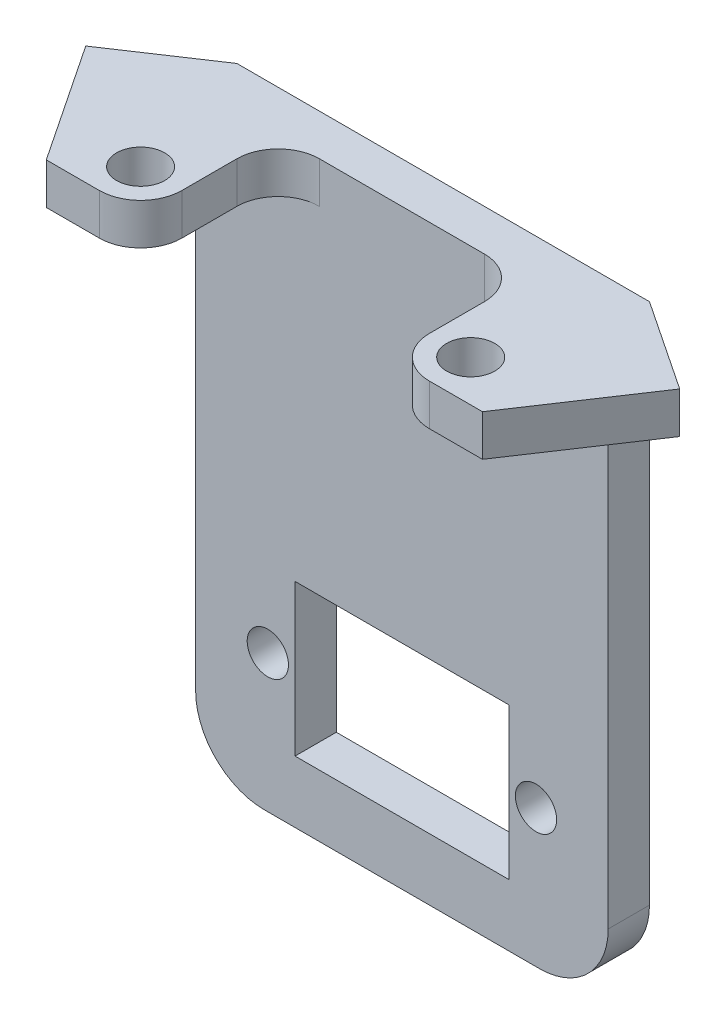
ISO-10303-21;
HEADER;
FILE_DESCRIPTION(('STEP AP214'),'2;1');
FILE_NAME('part.step','',(''),(''),'','','');
FILE_SCHEMA(('AUTOMOTIVE_DESIGN { 1 0 10303 214 1 1 1 1 }'));
ENDSEC;
DATA;
#1=APPLICATION_CONTEXT('core data for automotive mechanical design processes');
#2=APPLICATION_PROTOCOL_DEFINITION('international standard','automotive_design',2000,#1);
#3=PRODUCT_CONTEXT('',#1,'mechanical');
#4=PRODUCT('Part','Part','',(#3));
#5=PRODUCT_RELATED_PRODUCT_CATEGORY('part','',(#4));
#6=PRODUCT_DEFINITION_FORMATION('','',#4);
#7=PRODUCT_DEFINITION_CONTEXT('part definition',#1,'design');
#8=PRODUCT_DEFINITION('design','',#6,#7);
#9=PRODUCT_DEFINITION_SHAPE('','',#8);
#10=(LENGTH_UNIT() NAMED_UNIT(*) SI_UNIT(.MILLI.,.METRE.));
#11=(NAMED_UNIT(*) PLANE_ANGLE_UNIT() SI_UNIT($,.RADIAN.));
#12=(NAMED_UNIT(*) SI_UNIT($,.STERADIAN.) SOLID_ANGLE_UNIT());
#13=UNCERTAINTY_MEASURE_WITH_UNIT(LENGTH_MEASURE(1.E-05),#10,'distance_accuracy_value','');
#14=(GEOMETRIC_REPRESENTATION_CONTEXT(3) GLOBAL_UNCERTAINTY_ASSIGNED_CONTEXT((#13)) GLOBAL_UNIT_ASSIGNED_CONTEXT((#10,
#11,#12)) REPRESENTATION_CONTEXT('',''));
#15=CARTESIAN_POINT('',(0.,0.,0.));
#16=DIRECTION('',(0.,0.,1.));
#17=DIRECTION('',(1.,0.,0.));
#18=AXIS2_PLACEMENT_3D('',#15,#16,#17);
#19=CARTESIAN_POINT('',(15.,0.,0.));
#20=DIRECTION('',(1.,0.,0.));
#21=DIRECTION('',(0.,0.,-1.));
#22=AXIS2_PLACEMENT_3D('',#19,#20,#21);
#23=PLANE('',#22);
#24=DIRECTION('',(0.,1.,0.));
#25=VECTOR('',#24,1.);
#26=CARTESIAN_POINT('',(15.,-10.,0.));
#27=LINE('',#26,#25);
#28=CARTESIAN_POINT('',(15.,-5.,0.));
#29=VERTEX_POINT('',#28);
#30=CARTESIAN_POINT('',(15.,30.,0.));
#31=VERTEX_POINT('',#30);
#32=EDGE_CURVE('E310',#29,#31,#27,.T.);
#33=ORIENTED_EDGE('',*,*,#32,.T.);
#34=DIRECTION('',(0.,0.,-1.));
#35=VECTOR('',#34,1.);
#36=CARTESIAN_POINT('',(15.,30.,0.));
#37=LINE('',#36,#35);
#38=CARTESIAN_POINT('',(15.,30.,3.));
#39=VERTEX_POINT('',#38);
#40=EDGE_CURVE('E222',#39,#31,#37,.T.);
#41=ORIENTED_EDGE('',*,*,#40,.F.);
#42=DIRECTION('',(0.,-1.,0.));
#43=VECTOR('',#42,1.);
#44=CARTESIAN_POINT('',(15.,30.,3.));
#45=LINE('',#44,#43);
#46=CARTESIAN_POINT('',(15.,-5.,3.));
#47=VERTEX_POINT('',#46);
#48=EDGE_CURVE('E299',#39,#47,#45,.T.);
#49=ORIENTED_EDGE('',*,*,#48,.T.);
#50=DIRECTION('',(0.,0.,-1.));
#51=VECTOR('',#50,1.);
#52=CARTESIAN_POINT('',(15.,-5.,0.));
#53=LINE('',#52,#51);
#54=EDGE_CURVE('E386',#47,#29,#53,.T.);
#55=ORIENTED_EDGE('',*,*,#54,.T.);
#56=EDGE_LOOP('',(#33,#41,#49,#55));
#57=FACE_BOUND('',#56,.T.);
#58=ADVANCED_FACE('F39',(#57),#23,.T.);
#59=CARTESIAN_POINT('',(12.,0.,10.));
#60=DIRECTION('',(0.,-1.,0.));
#61=DIRECTION('',(0.,0.,-1.));
#62=AXIS2_PLACEMENT_3D('',#59,#60,#61);
#63=CYLINDRICAL_SURFACE('',#62,3.);
#64=CARTESIAN_POINT('',(12.,30.,10.));
#65=DIRECTION('',(0.,-1.,0.));
#66=DIRECTION('',(0.,0.,-1.));
#67=AXIS2_PLACEMENT_3D('',#64,#65,#66);
#68=CIRCLE('',#67,3.);
#69=CARTESIAN_POINT('',(12.,30.,13.));
#70=VERTEX_POINT('',#69);
#71=CARTESIAN_POINT('',(8.99999999999999,30.,9.99999999999999));
#72=VERTEX_POINT('',#71);
#73=EDGE_CURVE('E381',#70,#72,#68,.T.);
#74=ORIENTED_EDGE('',*,*,#73,.F.);
#75=DIRECTION('',(0.,-1.,0.));
#76=VECTOR('',#75,1.);
#77=CARTESIAN_POINT('',(12.,33.,13.));
#78=LINE('',#77,#76);
#79=CARTESIAN_POINT('',(12.,33.,13.));
#80=VERTEX_POINT('',#79);
#81=EDGE_CURVE('E204',#80,#70,#78,.T.);
#82=ORIENTED_EDGE('',*,*,#81,.F.);
#83=CARTESIAN_POINT('',(12.,33.,10.));
#84=DIRECTION('',(0.,1.,0.));
#85=DIRECTION('',(0.,0.,1.));
#86=AXIS2_PLACEMENT_3D('',#83,#84,#85);
#87=CIRCLE('',#86,3.);
#88=CARTESIAN_POINT('',(8.99999999999999,33.,9.99999999999999));
#89=VERTEX_POINT('',#88);
#90=EDGE_CURVE('E383',#89,#80,#87,.T.);
#91=ORIENTED_EDGE('',*,*,#90,.F.);
#92=DIRECTION('',(0.,-1.,0.));
#93=VECTOR('',#92,1.);
#94=CARTESIAN_POINT('',(8.99999999999999,33.,9.99999999999999));
#95=LINE('',#94,#93);
#96=EDGE_CURVE('E292',#89,#72,#95,.T.);
#97=ORIENTED_EDGE('',*,*,#96,.T.);
#98=EDGE_LOOP('',(#74,#82,#91,#97));
#99=FACE_BOUND('',#98,.T.);
#100=ADVANCED_FACE('F445',(#99),#63,.T.);
#101=CARTESIAN_POINT('',(-12.,0.,10.));
#102=DIRECTION('',(0.,1.,0.));
#103=DIRECTION('',(0.,0.,1.));
#104=AXIS2_PLACEMENT_3D('',#101,#102,#103);
#105=CYLINDRICAL_SURFACE('',#104,3.);
#106=CARTESIAN_POINT('',(-12.,33.,10.));
#107=DIRECTION('',(0.,1.,0.));
#108=DIRECTION('',(0.,0.,1.));
#109=AXIS2_PLACEMENT_3D('',#106,#107,#108);
#110=CIRCLE('',#109,3.);
#111=CARTESIAN_POINT('',(-12.,33.,13.));
#112=VERTEX_POINT('',#111);
#113=CARTESIAN_POINT('',(-9.,33.,10.));
#114=VERTEX_POINT('',#113);
#115=EDGE_CURVE('E374',#112,#114,#110,.T.);
#116=ORIENTED_EDGE('',*,*,#115,.F.);
#117=DIRECTION('',(0.,-1.,0.));
#118=VECTOR('',#117,1.);
#119=CARTESIAN_POINT('',(-12.,33.,13.));
#120=LINE('',#119,#118);
#121=CARTESIAN_POINT('',(-12.,30.,13.));
#122=VERTEX_POINT('',#121);
#123=EDGE_CURVE('E238',#112,#122,#120,.T.);
#124=ORIENTED_EDGE('',*,*,#123,.T.);
#125=CARTESIAN_POINT('',(-12.,30.,10.));
#126=DIRECTION('',(0.,-1.,0.));
#127=DIRECTION('',(0.,0.,-1.));
#128=AXIS2_PLACEMENT_3D('',#125,#126,#127);
#129=CIRCLE('',#128,3.);
#130=CARTESIAN_POINT('',(-9.,30.,10.));
#131=VERTEX_POINT('',#130);
#132=EDGE_CURVE('E378',#131,#122,#129,.T.);
#133=ORIENTED_EDGE('',*,*,#132,.F.);
#134=DIRECTION('',(0.,-1.,0.));
#135=VECTOR('',#134,1.);
#136=CARTESIAN_POINT('',(-9.,33.,10.));
#137=LINE('',#136,#135);
#138=EDGE_CURVE('E289',#114,#131,#137,.T.);
#139=ORIENTED_EDGE('',*,*,#138,.F.);
#140=EDGE_LOOP('',(#116,#124,#133,#139));
#141=FACE_BOUND('',#140,.T.);
#142=ADVANCED_FACE('F466',(#141),#105,.T.);
#143=CARTESIAN_POINT('',(0.,30.,0.));
#144=DIRECTION('',(0.,-1.,0.));
#145=DIRECTION('',(0.,0.,-1.));
#146=AXIS2_PLACEMENT_3D('',#143,#144,#145);
#147=PLANE('',#146);
#148=CARTESIAN_POINT('',(-6.,30.,6.));
#149=DIRECTION('',(0.,-1.,0.));
#150=DIRECTION('',(0.,0.,-1.));
#151=AXIS2_PLACEMENT_3D('',#148,#149,#150);
#152=CIRCLE('',#151,3.);
#153=CARTESIAN_POINT('',(-9.,30.,6.));
#154=VERTEX_POINT('',#153);
#155=CARTESIAN_POINT('',(-6.,30.,3.));
#156=VERTEX_POINT('',#155);
#157=EDGE_CURVE('E259',#154,#156,#152,.T.);
#158=ORIENTED_EDGE('',*,*,#157,.F.);
#159=DIRECTION('',(0.,0.,-1.));
#160=VECTOR('',#159,1.);
#161=CARTESIAN_POINT('',(-9.,30.,10.));
#162=LINE('',#161,#160);
#163=EDGE_CURVE('E277',#131,#154,#162,.T.);
#164=ORIENTED_EDGE('',*,*,#163,.F.);
#165=ORIENTED_EDGE('',*,*,#132,.T.);
#166=DIRECTION('',(-1.,0.,0.));
#167=VECTOR('',#166,1.);
#168=CARTESIAN_POINT('',(-12.,30.,13.));
#169=LINE('',#168,#167);
#170=CARTESIAN_POINT('',(-15.8574750835783,30.,13.));
#171=VERTEX_POINT('',#170);
#172=EDGE_CURVE('E224',#122,#171,#169,.T.);
#173=ORIENTED_EDGE('',*,*,#172,.T.);
#174=DIRECTION('',(-0.554700196225229,0.,-0.832050294337844));
#175=VECTOR('',#174,1.);
#176=CARTESIAN_POINT('',(-15.8574750835783,30.,13.));
#177=LINE('',#176,#175);
#178=CARTESIAN_POINT('',(-21.5936365963234,30.,4.39575773088234));
#179=VERTEX_POINT('',#178);
#180=EDGE_CURVE('E241',#171,#179,#177,.T.);
#181=ORIENTED_EDGE('',*,*,#180,.T.);
#182=DIRECTION('',(0.832050294337841,0.,-0.554700196225234));
#183=VECTOR('',#182,1.);
#184=CARTESIAN_POINT('',(-21.5936365963234,30.,4.39575773088234));
#185=LINE('',#184,#183);
#186=CARTESIAN_POINT('',(-15.,30.,0.));
#187=VERTEX_POINT('',#186);
#188=EDGE_CURVE('E244',#179,#187,#185,.T.);
#189=ORIENTED_EDGE('',*,*,#188,.T.);
#190=DIRECTION('',(0.,0.,1.));
#191=VECTOR('',#190,1.);
#192=CARTESIAN_POINT('',(-15.,30.,0.));
#193=LINE('',#192,#191);
#194=CARTESIAN_POINT('',(-15.,30.,3.));
#195=VERTEX_POINT('',#194);
#196=EDGE_CURVE('E233',#187,#195,#193,.T.);
#197=ORIENTED_EDGE('',*,*,#196,.T.);
#198=DIRECTION('',(1.,0.,0.));
#199=VECTOR('',#198,1.);
#200=CARTESIAN_POINT('',(-12.5,30.,3.));
#201=LINE('',#200,#199);
#202=EDGE_CURVE('E320',#195,#156,#201,.T.);
#203=ORIENTED_EDGE('',*,*,#202,.T.);
#204=EDGE_LOOP('',(#158,#164,#165,#173,#181,#189,#197,#203));
#205=FACE_BOUND('',#204,.T.);
#206=CARTESIAN_POINT('',(-12.,30.,10.));
#207=DIRECTION('',(0.,-1.,0.));
#208=DIRECTION('',(0.,0.,-1.));
#209=AXIS2_PLACEMENT_3D('',#206,#207,#208);
#210=CIRCLE('',#209,1.75);
#211=CARTESIAN_POINT('',(-12.,30.,8.25));
#212=VERTEX_POINT('',#211);
#213=EDGE_CURVE('E300',#212,#212,#210,.T.);
#214=ORIENTED_EDGE('',*,*,#213,.F.);
#215=EDGE_LOOP('',(#214));
#216=FACE_BOUND('',#215,.T.);
#217=ADVANCED_FACE('F428',(#205,#216),#147,.T.);
#218=CARTESIAN_POINT('',(0.,0.,3.));
#219=DIRECTION('',(0.,0.,-1.));
#220=DIRECTION('',(-1.,0.,0.));
#221=AXIS2_PLACEMENT_3D('',#218,#219,#220);
#222=PLANE('',#221);
#223=CARTESIAN_POINT('',(9.75,0.,3.));
#224=DIRECTION('',(0.,0.,1.));
#225=DIRECTION('',(1.,0.,0.));
#226=AXIS2_PLACEMENT_3D('',#223,#224,#225);
#227=CIRCLE('',#226,1.5);
#228=CARTESIAN_POINT('',(11.25,0.,3.));
#229=VERTEX_POINT('',#228);
#230=EDGE_CURVE('E359',#229,#229,#227,.T.);
#231=ORIENTED_EDGE('',*,*,#230,.F.);
#232=EDGE_LOOP('',(#231));
#233=FACE_BOUND('',#232,.T.);
#234=CARTESIAN_POINT('',(-9.75,0.,3.));
#235=DIRECTION('',(0.,0.,1.));
#236=DIRECTION('',(1.,0.,0.));
#237=AXIS2_PLACEMENT_3D('',#234,#235,#236);
#238=CIRCLE('',#237,1.5);
#239=CARTESIAN_POINT('',(-8.25,0.,3.));
#240=VERTEX_POINT('',#239);
#241=EDGE_CURVE('E365',#240,#240,#238,.T.);
#242=ORIENTED_EDGE('',*,*,#241,.F.);
#243=EDGE_LOOP('',(#242));
#244=FACE_BOUND('',#243,.T.);
#245=DIRECTION('',(1.,0.,0.));
#246=VECTOR('',#245,1.);
#247=CARTESIAN_POINT('',(-7.77000000000001,-5.5,3.));
#248=LINE('',#247,#246);
#249=CARTESIAN_POINT('',(-7.77000000000001,-5.5,3.));
#250=VERTEX_POINT('',#249);
#251=CARTESIAN_POINT('',(7.77,-5.5,3.));
#252=VERTEX_POINT('',#251);
#253=EDGE_CURVE('E342',#250,#252,#248,.T.);
#254=ORIENTED_EDGE('',*,*,#253,.F.);
#255=DIRECTION('',(0.,-1.,0.));
#256=VECTOR('',#255,1.);
#257=CARTESIAN_POINT('',(-7.77000000000001,5.5,3.));
#258=LINE('',#257,#256);
#259=CARTESIAN_POINT('',(-7.77000000000001,5.5,3.));
#260=VERTEX_POINT('',#259);
#261=EDGE_CURVE('E326',#260,#250,#258,.T.);
#262=ORIENTED_EDGE('',*,*,#261,.F.);
#263=DIRECTION('',(-1.,0.,0.));
#264=VECTOR('',#263,1.);
#265=CARTESIAN_POINT('',(-7.77000000000001,5.5,3.));
#266=LINE('',#265,#264);
#267=CARTESIAN_POINT('',(7.76999999999999,5.5,3.));
#268=VERTEX_POINT('',#267);
#269=EDGE_CURVE('E331',#268,#260,#266,.T.);
#270=ORIENTED_EDGE('',*,*,#269,.F.);
#271=DIRECTION('',(0.,1.,0.));
#272=VECTOR('',#271,1.);
#273=CARTESIAN_POINT('',(7.76999999999999,5.5,3.));
#274=LINE('',#273,#272);
#275=EDGE_CURVE('E345',#252,#268,#274,.T.);
#276=ORIENTED_EDGE('',*,*,#275,.F.);
#277=EDGE_LOOP('',(#254,#262,#270,#276));
#278=FACE_BOUND('',#277,.T.);
#279=DIRECTION('',(1.,0.,0.));
#280=VECTOR('',#279,1.);
#281=CARTESIAN_POINT('',(-12.5,-10.,3.));
#282=LINE('',#281,#280);
#283=CARTESIAN_POINT('',(-10.,-10.,3.));
#284=VERTEX_POINT('',#283);
#285=CARTESIAN_POINT('',(10.,-10.,3.));
#286=VERTEX_POINT('',#285);
#287=EDGE_CURVE('E371',#284,#286,#282,.T.);
#288=ORIENTED_EDGE('',*,*,#287,.T.);
#289=CARTESIAN_POINT('',(10.,-5.,3.));
#290=DIRECTION('',(0.,0.,-1.));
#291=DIRECTION('',(-1.,0.,0.));
#292=AXIS2_PLACEMENT_3D('',#289,#290,#291);
#293=CIRCLE('',#292,5.);
#294=EDGE_CURVE('E47',#286,#47,#293,.F.);
#295=ORIENTED_EDGE('',*,*,#294,.T.);
#296=ORIENTED_EDGE('',*,*,#48,.F.);
#297=CARTESIAN_POINT('',(6.,30.,3.));
#298=VERTEX_POINT('',#297);
#299=EDGE_CURVE('E319',#298,#39,#201,.T.);
#300=ORIENTED_EDGE('',*,*,#299,.F.);
#301=DIRECTION('',(0.,-1.,0.));
#302=VECTOR('',#301,1.);
#303=CARTESIAN_POINT('',(6.,33.,3.));
#304=LINE('',#303,#302);
#305=CARTESIAN_POINT('',(6.,33.,3.));
#306=VERTEX_POINT('',#305);
#307=EDGE_CURVE('E282',#306,#298,#304,.T.);
#308=ORIENTED_EDGE('',*,*,#307,.F.);
#309=DIRECTION('',(1.,0.,0.));
#310=VECTOR('',#309,1.);
#311=CARTESIAN_POINT('',(-6.,33.,3.));
#312=LINE('',#311,#310);
#313=CARTESIAN_POINT('',(-6.,33.,3.));
#314=VERTEX_POINT('',#313);
#315=EDGE_CURVE('E268',#314,#306,#312,.T.);
#316=ORIENTED_EDGE('',*,*,#315,.F.);
#317=DIRECTION('',(0.,-1.,0.));
#318=VECTOR('',#317,1.);
#319=CARTESIAN_POINT('',(-6.,33.,3.));
#320=LINE('',#319,#318);
#321=EDGE_CURVE('E285',#314,#156,#320,.T.);
#322=ORIENTED_EDGE('',*,*,#321,.T.);
#323=ORIENTED_EDGE('',*,*,#202,.F.);
#324=DIRECTION('',(0.,1.,0.));
#325=VECTOR('',#324,1.);
#326=CARTESIAN_POINT('',(-15.,-10.,3.));
#327=LINE('',#326,#325);
#328=CARTESIAN_POINT('',(-15.,-5.,3.));
#329=VERTEX_POINT('',#328);
#330=EDGE_CURVE('E313',#329,#195,#327,.T.);
#331=ORIENTED_EDGE('',*,*,#330,.F.);
#332=CARTESIAN_POINT('',(-10.,-5.,3.));
#333=DIRECTION('',(0.,0.,-1.));
#334=DIRECTION('',(-1.,0.,0.));
#335=AXIS2_PLACEMENT_3D('',#332,#333,#334);
#336=CIRCLE('',#335,5.);
#337=EDGE_CURVE('E62',#329,#284,#336,.F.);
#338=ORIENTED_EDGE('',*,*,#337,.T.);
#339=EDGE_LOOP('',(#288,#295,#296,#300,#308,#316,#322,#323,#331,#338));
#340=FACE_BOUND('',#339,.T.);
#341=ADVANCED_FACE('F401',(#233,#244,#278,#340),#222,.F.);
#342=CARTESIAN_POINT('',(0.,0.,0.));
#343=DIRECTION('',(0.,0.,-1.));
#344=DIRECTION('',(-1.,0.,0.));
#345=AXIS2_PLACEMENT_3D('',#342,#343,#344);
#346=PLANE('',#345);
#347=DIRECTION('',(0.,-1.,0.));
#348=VECTOR('',#347,1.);
#349=CARTESIAN_POINT('',(-7.77000000000001,5.5,0.));
#350=LINE('',#349,#348);
#351=CARTESIAN_POINT('',(-7.77000000000001,5.5,0.));
#352=VERTEX_POINT('',#351);
#353=CARTESIAN_POINT('',(-7.77000000000001,-5.5,0.));
#354=VERTEX_POINT('',#353);
#355=EDGE_CURVE('E327',#352,#354,#350,.T.);
#356=ORIENTED_EDGE('',*,*,#355,.T.);
#357=DIRECTION('',(1.,0.,0.));
#358=VECTOR('',#357,1.);
#359=CARTESIAN_POINT('',(-7.77000000000001,-5.5,0.));
#360=LINE('',#359,#358);
#361=CARTESIAN_POINT('',(7.77,-5.5,0.));
#362=VERTEX_POINT('',#361);
#363=EDGE_CURVE('E330',#354,#362,#360,.T.);
#364=ORIENTED_EDGE('',*,*,#363,.T.);
#365=DIRECTION('',(0.,1.,0.));
#366=VECTOR('',#365,1.);
#367=CARTESIAN_POINT('',(7.76999999999999,5.5,0.));
#368=LINE('',#367,#366);
#369=CARTESIAN_POINT('',(7.76999999999999,5.5,0.));
#370=VERTEX_POINT('',#369);
#371=EDGE_CURVE('E334',#362,#370,#368,.T.);
#372=ORIENTED_EDGE('',*,*,#371,.T.);
#373=DIRECTION('',(-1.,0.,0.));
#374=VECTOR('',#373,1.);
#375=CARTESIAN_POINT('',(-7.77000000000001,5.5,0.));
#376=LINE('',#375,#374);
#377=EDGE_CURVE('E337',#370,#352,#376,.T.);
#378=ORIENTED_EDGE('',*,*,#377,.T.);
#379=EDGE_LOOP('',(#356,#364,#372,#378));
#380=FACE_BOUND('',#379,.T.);
#381=CARTESIAN_POINT('',(-9.75,0.,0.));
#382=DIRECTION('',(0.,0.,1.));
#383=DIRECTION('',(1.,0.,0.));
#384=AXIS2_PLACEMENT_3D('',#381,#382,#383);
#385=CIRCLE('',#384,1.5);
#386=CARTESIAN_POINT('',(-8.25,0.,0.));
#387=VERTEX_POINT('',#386);
#388=EDGE_CURVE('E362',#387,#387,#385,.T.);
#389=ORIENTED_EDGE('',*,*,#388,.T.);
#390=EDGE_LOOP('',(#389));
#391=FACE_BOUND('',#390,.T.);
#392=ORIENTED_EDGE('',*,*,#32,.F.);
#393=CARTESIAN_POINT('',(10.,-5.,0.));
#394=DIRECTION('',(0.,0.,-1.));
#395=DIRECTION('',(-1.,0.,0.));
#396=AXIS2_PLACEMENT_3D('',#393,#394,#395);
#397=CIRCLE('',#396,5.);
#398=CARTESIAN_POINT('',(10.,-10.,0.));
#399=VERTEX_POINT('',#398);
#400=EDGE_CURVE('E392',#29,#399,#397,.T.);
#401=ORIENTED_EDGE('',*,*,#400,.T.);
#402=DIRECTION('',(1.,0.,0.));
#403=VECTOR('',#402,1.);
#404=CARTESIAN_POINT('',(-12.5,-10.,0.));
#405=LINE('',#404,#403);
#406=CARTESIAN_POINT('',(-10.,-10.,0.));
#407=VERTEX_POINT('',#406);
#408=EDGE_CURVE('E368',#407,#399,#405,.T.);
#409=ORIENTED_EDGE('',*,*,#408,.F.);
#410=CARTESIAN_POINT('',(-10.,-5.,0.));
#411=DIRECTION('',(0.,0.,-1.));
#412=DIRECTION('',(-1.,0.,0.));
#413=AXIS2_PLACEMENT_3D('',#410,#411,#412);
#414=CIRCLE('',#413,5.);
#415=CARTESIAN_POINT('',(-15.,-5.,0.));
#416=VERTEX_POINT('',#415);
#417=EDGE_CURVE('E389',#407,#416,#414,.T.);
#418=ORIENTED_EDGE('',*,*,#417,.T.);
#419=DIRECTION('',(0.,-1.,0.));
#420=VECTOR('',#419,1.);
#421=CARTESIAN_POINT('',(-15.,33.,0.));
#422=LINE('',#421,#420);
#423=EDGE_CURVE('E316',#187,#416,#422,.T.);
#424=ORIENTED_EDGE('',*,*,#423,.F.);
#425=CARTESIAN_POINT('',(-15.,33.,0.));
#426=VERTEX_POINT('',#425);
#427=EDGE_CURVE('E317',#426,#187,#422,.T.);
#428=ORIENTED_EDGE('',*,*,#427,.F.);
#429=DIRECTION('',(-1.,0.,0.));
#430=VECTOR('',#429,1.);
#431=CARTESIAN_POINT('',(12.5,33.,0.));
#432=LINE('',#431,#430);
#433=CARTESIAN_POINT('',(15.,33.,0.));
#434=VERTEX_POINT('',#433);
#435=EDGE_CURVE('E323',#434,#426,#432,.T.);
#436=ORIENTED_EDGE('',*,*,#435,.F.);
#437=DIRECTION('',(0.,-1.,0.));
#438=VECTOR('',#437,1.);
#439=CARTESIAN_POINT('',(15.,33.,0.));
#440=LINE('',#439,#438);
#441=EDGE_CURVE('E227',#434,#31,#440,.T.);
#442=ORIENTED_EDGE('',*,*,#441,.T.);
#443=EDGE_LOOP('',(#392,#401,#409,#418,#424,#428,#436,#442));
#444=FACE_BOUND('',#443,.T.);
#445=CARTESIAN_POINT('',(9.75,0.,0.));
#446=DIRECTION('',(0.,0.,1.));
#447=DIRECTION('',(1.,0.,0.));
#448=AXIS2_PLACEMENT_3D('',#445,#446,#447);
#449=CIRCLE('',#448,1.5);
#450=CARTESIAN_POINT('',(11.25,0.,0.));
#451=VERTEX_POINT('',#450);
#452=EDGE_CURVE('E352',#451,#451,#449,.T.);
#453=ORIENTED_EDGE('',*,*,#452,.T.);
#454=EDGE_LOOP('',(#453));
#455=FACE_BOUND('',#454,.T.);
#456=ADVANCED_FACE('F412',(#380,#391,#444,#455),#346,.T.);
#457=CARTESIAN_POINT('',(-12.5,-10.,3.));
#458=DIRECTION('',(0.,1.,0.));
#459=DIRECTION('',(0.,0.,1.));
#460=AXIS2_PLACEMENT_3D('',#457,#458,#459);
#461=PLANE('',#460);
#462=ORIENTED_EDGE('',*,*,#408,.T.);
#463=DIRECTION('',(0.,0.,-1.));
#464=VECTOR('',#463,1.);
#465=CARTESIAN_POINT('',(10.,-10.,3.));
#466=LINE('',#465,#464);
#467=EDGE_CURVE('E396',#399,#286,#466,.F.);
#468=ORIENTED_EDGE('',*,*,#467,.T.);
#469=ORIENTED_EDGE('',*,*,#287,.F.);
#470=DIRECTION('',(0.,0.,1.));
#471=VECTOR('',#470,1.);
#472=CARTESIAN_POINT('',(-10.,-10.,0.));
#473=LINE('',#472,#471);
#474=EDGE_CURVE('E394',#284,#407,#473,.F.);
#475=ORIENTED_EDGE('',*,*,#474,.T.);
#476=EDGE_LOOP('',(#462,#468,#469,#475));
#477=FACE_BOUND('',#476,.T.);
#478=ADVANCED_FACE('F417',(#477),#461,.F.);
#479=CARTESIAN_POINT('',(-9.75,0.,3.));
#480=DIRECTION('',(0.,0.,-1.));
#481=DIRECTION('',(-1.,0.,0.));
#482=AXIS2_PLACEMENT_3D('',#479,#480,#481);
#483=CYLINDRICAL_SURFACE('',#482,1.5);
#484=ORIENTED_EDGE('',*,*,#241,.T.);
#485=EDGE_LOOP('',(#484));
#486=FACE_BOUND('',#485,.T.);
#487=ORIENTED_EDGE('',*,*,#388,.F.);
#488=EDGE_LOOP('',(#487));
#489=FACE_BOUND('',#488,.T.);
#490=ADVANCED_FACE('F515',(#486,#489),#483,.F.);
#491=CARTESIAN_POINT('',(9.75,0.,3.));
#492=DIRECTION('',(0.,0.,-1.));
#493=DIRECTION('',(-1.,0.,0.));
#494=AXIS2_PLACEMENT_3D('',#491,#492,#493);
#495=CYLINDRICAL_SURFACE('',#494,1.5);
#496=ORIENTED_EDGE('',*,*,#230,.T.);
#497=EDGE_LOOP('',(#496));
#498=FACE_BOUND('',#497,.T.);
#499=ORIENTED_EDGE('',*,*,#452,.F.);
#500=EDGE_LOOP('',(#499));
#501=FACE_BOUND('',#500,.T.);
#502=ADVANCED_FACE('F511',(#498,#501),#495,.F.);
#503=CARTESIAN_POINT('',(-7.77000000000001,5.5,0.));
#504=DIRECTION('',(-1.,0.,0.));
#505=DIRECTION('',(0.,0.,1.));
#506=AXIS2_PLACEMENT_3D('',#503,#504,#505);
#507=PLANE('',#506);
#508=ORIENTED_EDGE('',*,*,#261,.T.);
#509=DIRECTION('',(0.,0.,1.));
#510=VECTOR('',#509,1.);
#511=CARTESIAN_POINT('',(-7.77000000000001,-5.5,0.));
#512=LINE('',#511,#510);
#513=EDGE_CURVE('E340',#354,#250,#512,.T.);
#514=ORIENTED_EDGE('',*,*,#513,.F.);
#515=ORIENTED_EDGE('',*,*,#355,.F.);
#516=DIRECTION('',(0.,0.,1.));
#517=VECTOR('',#516,1.);
#518=CARTESIAN_POINT('',(-7.77000000000001,5.5,0.));
#519=LINE('',#518,#517);
#520=EDGE_CURVE('E350',#352,#260,#519,.T.);
#521=ORIENTED_EDGE('',*,*,#520,.T.);
#522=EDGE_LOOP('',(#508,#514,#515,#521));
#523=FACE_BOUND('',#522,.T.);
#524=ADVANCED_FACE('F501',(#523),#507,.F.);
#525=CARTESIAN_POINT('',(-7.77000000000001,5.5,0.));
#526=DIRECTION('',(0.,1.,0.));
#527=DIRECTION('',(-1.,0.,0.));
#528=AXIS2_PLACEMENT_3D('',#525,#526,#527);
#529=PLANE('',#528);
#530=ORIENTED_EDGE('',*,*,#269,.T.);
#531=ORIENTED_EDGE('',*,*,#520,.F.);
#532=ORIENTED_EDGE('',*,*,#377,.F.);
#533=DIRECTION('',(0.,0.,1.));
#534=VECTOR('',#533,1.);
#535=CARTESIAN_POINT('',(7.76999999999999,5.5,0.));
#536=LINE('',#535,#534);
#537=EDGE_CURVE('E353',#370,#268,#536,.T.);
#538=ORIENTED_EDGE('',*,*,#537,.T.);
#539=EDGE_LOOP('',(#530,#531,#532,#538));
#540=FACE_BOUND('',#539,.T.);
#541=ADVANCED_FACE('F497',(#540),#529,.F.);
#542=CARTESIAN_POINT('',(7.76999999999999,5.5,0.));
#543=DIRECTION('',(1.,0.,0.));
#544=DIRECTION('',(0.,1.,0.));
#545=AXIS2_PLACEMENT_3D('',#542,#543,#544);
#546=PLANE('',#545);
#547=ORIENTED_EDGE('',*,*,#275,.T.);
#548=ORIENTED_EDGE('',*,*,#537,.F.);
#549=ORIENTED_EDGE('',*,*,#371,.F.);
#550=DIRECTION('',(0.,0.,1.));
#551=VECTOR('',#550,1.);
#552=CARTESIAN_POINT('',(7.77,-5.5,0.));
#553=LINE('',#552,#551);
#554=EDGE_CURVE('E355',#362,#252,#553,.T.);
#555=ORIENTED_EDGE('',*,*,#554,.T.);
#556=EDGE_LOOP('',(#547,#548,#549,#555));
#557=FACE_BOUND('',#556,.T.);
#558=ADVANCED_FACE('F500',(#557),#546,.F.);
#559=CARTESIAN_POINT('',(-7.77000000000001,-5.5,0.));
#560=DIRECTION('',(0.,-1.,0.));
#561=DIRECTION('',(0.,0.,-1.));
#562=AXIS2_PLACEMENT_3D('',#559,#560,#561);
#563=PLANE('',#562);
#564=ORIENTED_EDGE('',*,*,#253,.T.);
#565=ORIENTED_EDGE('',*,*,#554,.F.);
#566=ORIENTED_EDGE('',*,*,#363,.F.);
#567=ORIENTED_EDGE('',*,*,#513,.T.);
#568=EDGE_LOOP('',(#564,#565,#566,#567));
#569=FACE_BOUND('',#568,.T.);
#570=ADVANCED_FACE('F496',(#569),#563,.F.);
#571=CARTESIAN_POINT('',(0.,33.,0.));
#572=DIRECTION('',(0.,1.,0.));
#573=DIRECTION('',(0.,0.,1.));
#574=AXIS2_PLACEMENT_3D('',#571,#572,#573);
#575=PLANE('',#574);
#576=ORIENTED_EDGE('',*,*,#435,.T.);
#577=DIRECTION('',(0.832050294337841,0.,-0.554700196225234));
#578=VECTOR('',#577,1.);
#579=CARTESIAN_POINT('',(-21.5936365963234,33.,4.39575773088234));
#580=LINE('',#579,#578);
#581=CARTESIAN_POINT('',(-21.5936365963234,33.,4.39575773088234));
#582=VERTEX_POINT('',#581);
#583=EDGE_CURVE('E236',#582,#426,#580,.T.);
#584=ORIENTED_EDGE('',*,*,#583,.F.);
#585=DIRECTION('',(-0.554700196225229,0.,-0.832050294337844));
#586=VECTOR('',#585,1.);
#587=CARTESIAN_POINT('',(-15.8574750835783,33.,13.));
#588=LINE('',#587,#586);
#589=CARTESIAN_POINT('',(-15.8574750835783,33.,13.));
#590=VERTEX_POINT('',#589);
#591=EDGE_CURVE('E232',#590,#582,#588,.T.);
#592=ORIENTED_EDGE('',*,*,#591,.F.);
#593=DIRECTION('',(-1.,0.,0.));
#594=VECTOR('',#593,1.);
#595=CARTESIAN_POINT('',(-12.,33.,13.));
#596=LINE('',#595,#594);
#597=EDGE_CURVE('E229',#112,#590,#596,.T.);
#598=ORIENTED_EDGE('',*,*,#597,.F.);
#599=ORIENTED_EDGE('',*,*,#115,.T.);
#600=DIRECTION('',(0.,0.,-1.));
#601=VECTOR('',#600,1.);
#602=CARTESIAN_POINT('',(-9.,33.,10.));
#603=LINE('',#602,#601);
#604=CARTESIAN_POINT('',(-9.,33.,6.));
#605=VERTEX_POINT('',#604);
#606=EDGE_CURVE('E262',#114,#605,#603,.T.);
#607=ORIENTED_EDGE('',*,*,#606,.T.);
#608=CARTESIAN_POINT('',(-6.,33.,6.));
#609=DIRECTION('',(0.,-1.,0.));
#610=DIRECTION('',(0.,0.,-1.));
#611=AXIS2_PLACEMENT_3D('',#608,#609,#610);
#612=CIRCLE('',#611,3.);
#613=EDGE_CURVE('E265',#605,#314,#612,.T.);
#614=ORIENTED_EDGE('',*,*,#613,.T.);
#615=ORIENTED_EDGE('',*,*,#315,.T.);
#616=CARTESIAN_POINT('',(6.,33.,6.));
#617=DIRECTION('',(0.,-1.,0.));
#618=DIRECTION('',(0.,0.,1.));
#619=AXIS2_PLACEMENT_3D('',#616,#617,#618);
#620=CIRCLE('',#619,3.);
#621=CARTESIAN_POINT('',(9.,33.,6.));
#622=VERTEX_POINT('',#621);
#623=EDGE_CURVE('E255',#306,#622,#620,.T.);
#624=ORIENTED_EDGE('',*,*,#623,.T.);
#625=DIRECTION('',(0.,0.,1.));
#626=VECTOR('',#625,1.);
#627=CARTESIAN_POINT('',(9.,33.,9.99999999999999));
#628=LINE('',#627,#626);
#629=EDGE_CURVE('E258',#622,#89,#628,.T.);
#630=ORIENTED_EDGE('',*,*,#629,.T.);
#631=ORIENTED_EDGE('',*,*,#90,.T.);
#632=DIRECTION('',(-1.,0.,0.));
#633=VECTOR('',#632,1.);
#634=CARTESIAN_POINT('',(12.,33.,13.));
#635=LINE('',#634,#633);
#636=CARTESIAN_POINT('',(15.8574750835783,33.,13.));
#637=VERTEX_POINT('',#636);
#638=EDGE_CURVE('E225',#637,#80,#635,.T.);
#639=ORIENTED_EDGE('',*,*,#638,.F.);
#640=DIRECTION('',(-0.554700196225229,0.,0.832050294337844));
#641=VECTOR('',#640,1.);
#642=CARTESIAN_POINT('',(15.8574750835783,33.,13.));
#643=LINE('',#642,#641);
#644=CARTESIAN_POINT('',(21.5936365963234,33.,4.39575773088234));
#645=VERTEX_POINT('',#644);
#646=EDGE_CURVE('E200',#645,#637,#643,.T.);
#647=ORIENTED_EDGE('',*,*,#646,.F.);
#648=DIRECTION('',(0.832050294337841,0.,0.554700196225234));
#649=VECTOR('',#648,1.);
#650=CARTESIAN_POINT('',(21.5936365963234,33.,4.39575773088234));
#651=LINE('',#650,#649);
#652=EDGE_CURVE('E215',#434,#645,#651,.T.);
#653=ORIENTED_EDGE('',*,*,#652,.F.);
#654=EDGE_LOOP('',(#576,#584,#592,#598,#599,#607,#614,#615,#624,#630,#631,#639,#647,#653));
#655=FACE_BOUND('',#654,.T.);
#656=CARTESIAN_POINT('',(-12.,33.,10.));
#657=DIRECTION('',(0.,-1.,0.));
#658=DIRECTION('',(0.,0.,-1.));
#659=AXIS2_PLACEMENT_3D('',#656,#657,#658);
#660=CIRCLE('',#659,1.75);
#661=CARTESIAN_POINT('',(-12.,33.,8.25));
#662=VERTEX_POINT('',#661);
#663=EDGE_CURVE('E296',#662,#662,#660,.T.);
#664=ORIENTED_EDGE('',*,*,#663,.T.);
#665=EDGE_LOOP('',(#664));
#666=FACE_BOUND('',#665,.T.);
#667=CARTESIAN_POINT('',(12.,33.,10.));
#668=DIRECTION('',(0.,-1.,0.));
#669=DIRECTION('',(0.,0.,-1.));
#670=AXIS2_PLACEMENT_3D('',#667,#668,#669);
#671=CIRCLE('',#670,1.75);
#672=CARTESIAN_POINT('',(12.,33.,8.25));
#673=VERTEX_POINT('',#672);
#674=EDGE_CURVE('E284',#673,#673,#671,.T.);
#675=ORIENTED_EDGE('',*,*,#674,.T.);
#676=EDGE_LOOP('',(#675));
#677=FACE_BOUND('',#676,.T.);
#678=ADVANCED_FACE('F438',(#655,#666,#677),#575,.T.);
#679=ORIENTED_EDGE('',*,*,#299,.T.);
#680=ORIENTED_EDGE('',*,*,#40,.T.);
#681=DIRECTION('',(0.832050294337841,0.,0.554700196225234));
#682=VECTOR('',#681,1.);
#683=CARTESIAN_POINT('',(21.5936365963234,30.,4.39575773088234));
#684=LINE('',#683,#682);
#685=CARTESIAN_POINT('',(21.5936365963234,30.,4.39575773088234));
#686=VERTEX_POINT('',#685);
#687=EDGE_CURVE('E210',#31,#686,#684,.T.);
#688=ORIENTED_EDGE('',*,*,#687,.T.);
#689=DIRECTION('',(-0.554700196225229,0.,0.832050294337844));
#690=VECTOR('',#689,1.);
#691=CARTESIAN_POINT('',(15.8574750835783,30.,13.));
#692=LINE('',#691,#690);
#693=CARTESIAN_POINT('',(15.8574750835783,30.,13.));
#694=VERTEX_POINT('',#693);
#695=EDGE_CURVE('E197',#686,#694,#692,.T.);
#696=ORIENTED_EDGE('',*,*,#695,.T.);
#697=DIRECTION('',(-1.,0.,0.));
#698=VECTOR('',#697,1.);
#699=CARTESIAN_POINT('',(12.,30.,13.));
#700=LINE('',#699,#698);
#701=EDGE_CURVE('E54',#694,#70,#700,.T.);
#702=ORIENTED_EDGE('',*,*,#701,.T.);
#703=ORIENTED_EDGE('',*,*,#73,.T.);
#704=DIRECTION('',(0.,0.,1.));
#705=VECTOR('',#704,1.);
#706=CARTESIAN_POINT('',(9.,30.,9.99999999999999));
#707=LINE('',#706,#705);
#708=CARTESIAN_POINT('',(9.,30.,6.));
#709=VERTEX_POINT('',#708);
#710=EDGE_CURVE('E274',#709,#72,#707,.T.);
#711=ORIENTED_EDGE('',*,*,#710,.F.);
#712=CARTESIAN_POINT('',(6.,30.,6.));
#713=DIRECTION('',(0.,-1.,0.));
#714=DIRECTION('',(0.,0.,1.));
#715=AXIS2_PLACEMENT_3D('',#712,#713,#714);
#716=CIRCLE('',#715,3.);
#717=EDGE_CURVE('E250',#298,#709,#716,.T.);
#718=ORIENTED_EDGE('',*,*,#717,.F.);
#719=EDGE_LOOP('',(#679,#680,#688,#696,#702,#703,#711,#718));
#720=FACE_BOUND('',#719,.T.);
#721=CARTESIAN_POINT('',(12.,30.,10.));
#722=DIRECTION('',(0.,-1.,0.));
#723=DIRECTION('',(0.,0.,-1.));
#724=AXIS2_PLACEMENT_3D('',#721,#722,#723);
#725=CIRCLE('',#724,1.75);
#726=CARTESIAN_POINT('',(12.,30.,8.25));
#727=VERTEX_POINT('',#726);
#728=EDGE_CURVE('E303',#727,#727,#725,.T.);
#729=ORIENTED_EDGE('',*,*,#728,.F.);
#730=EDGE_LOOP('',(#729));
#731=FACE_BOUND('',#730,.T.);
#732=ADVANCED_FACE('F207',(#720,#731),#147,.T.);
#733=CARTESIAN_POINT('',(-15.,0.,0.));
#734=DIRECTION('',(-1.,0.,0.));
#735=DIRECTION('',(0.,0.,1.));
#736=AXIS2_PLACEMENT_3D('',#733,#734,#735);
#737=PLANE('',#736);
#738=ORIENTED_EDGE('',*,*,#196,.F.);
#739=ORIENTED_EDGE('',*,*,#423,.T.);
#740=DIRECTION('',(0.,0.,1.));
#741=VECTOR('',#740,1.);
#742=CARTESIAN_POINT('',(-15.,-5.,3.));
#743=LINE('',#742,#741);
#744=EDGE_CURVE('E11',#416,#329,#743,.T.);
#745=ORIENTED_EDGE('',*,*,#744,.T.);
#746=ORIENTED_EDGE('',*,*,#330,.T.);
#747=EDGE_LOOP('',(#738,#739,#745,#746));
#748=FACE_BOUND('',#747,.T.);
#749=ADVANCED_FACE('F423',(#748),#737,.T.);
#750=CARTESIAN_POINT('',(12.,33.,10.));
#751=DIRECTION('',(0.,-1.,0.));
#752=DIRECTION('',(0.,0.,-1.));
#753=AXIS2_PLACEMENT_3D('',#750,#751,#752);
#754=CYLINDRICAL_SURFACE('',#753,1.75);
#755=ORIENTED_EDGE('',*,*,#674,.F.);
#756=EDGE_LOOP('',(#755));
#757=FACE_BOUND('',#756,.T.);
#758=ORIENTED_EDGE('',*,*,#728,.T.);
#759=EDGE_LOOP('',(#758));
#760=FACE_BOUND('',#759,.T.);
#761=ADVANCED_FACE('F488',(#757,#760),#754,.F.);
#762=CARTESIAN_POINT('',(-12.,33.,10.));
#763=DIRECTION('',(0.,-1.,0.));
#764=DIRECTION('',(0.,0.,-1.));
#765=AXIS2_PLACEMENT_3D('',#762,#763,#764);
#766=CYLINDRICAL_SURFACE('',#765,1.75);
#767=ORIENTED_EDGE('',*,*,#663,.F.);
#768=EDGE_LOOP('',(#767));
#769=FACE_BOUND('',#768,.T.);
#770=ORIENTED_EDGE('',*,*,#213,.T.);
#771=EDGE_LOOP('',(#770));
#772=FACE_BOUND('',#771,.T.);
#773=ADVANCED_FACE('F542',(#769,#772),#766,.F.);
#774=CARTESIAN_POINT('',(6.,33.,6.));
#775=DIRECTION('',(0.,-1.,0.));
#776=DIRECTION('',(0.,0.,-1.));
#777=AXIS2_PLACEMENT_3D('',#774,#775,#776);
#778=CYLINDRICAL_SURFACE('',#777,3.);
#779=ORIENTED_EDGE('',*,*,#717,.T.);
#780=DIRECTION('',(0.,-1.,0.));
#781=VECTOR('',#780,1.);
#782=CARTESIAN_POINT('',(9.,33.,6.));
#783=LINE('',#782,#781);
#784=EDGE_CURVE('E271',#622,#709,#783,.T.);
#785=ORIENTED_EDGE('',*,*,#784,.F.);
#786=ORIENTED_EDGE('',*,*,#623,.F.);
#787=ORIENTED_EDGE('',*,*,#307,.T.);
#788=EDGE_LOOP('',(#779,#785,#786,#787));
#789=FACE_BOUND('',#788,.T.);
#790=ADVANCED_FACE('F454',(#789),#778,.F.);
#791=CARTESIAN_POINT('',(-6.,33.,6.));
#792=DIRECTION('',(0.,-1.,0.));
#793=DIRECTION('',(0.,0.,-1.));
#794=AXIS2_PLACEMENT_3D('',#791,#792,#793);
#795=CYLINDRICAL_SURFACE('',#794,3.);
#796=ORIENTED_EDGE('',*,*,#157,.T.);
#797=ORIENTED_EDGE('',*,*,#321,.F.);
#798=ORIENTED_EDGE('',*,*,#613,.F.);
#799=DIRECTION('',(0.,-1.,0.));
#800=VECTOR('',#799,1.);
#801=CARTESIAN_POINT('',(-9.,33.,6.));
#802=LINE('',#801,#800);
#803=EDGE_CURVE('E287',#605,#154,#802,.T.);
#804=ORIENTED_EDGE('',*,*,#803,.T.);
#805=EDGE_LOOP('',(#796,#797,#798,#804));
#806=FACE_BOUND('',#805,.T.);
#807=ADVANCED_FACE('F459',(#806),#795,.F.);
#808=CARTESIAN_POINT('',(-9.,33.,10.));
#809=DIRECTION('',(-1.,0.,0.));
#810=DIRECTION('',(0.,0.,1.));
#811=AXIS2_PLACEMENT_3D('',#808,#809,#810);
#812=PLANE('',#811);
#813=ORIENTED_EDGE('',*,*,#163,.T.);
#814=ORIENTED_EDGE('',*,*,#803,.F.);
#815=ORIENTED_EDGE('',*,*,#606,.F.);
#816=ORIENTED_EDGE('',*,*,#138,.T.);
#817=EDGE_LOOP('',(#813,#814,#815,#816));
#818=FACE_BOUND('',#817,.T.);
#819=ADVANCED_FACE('F462',(#818),#812,.F.);
#820=CARTESIAN_POINT('',(9.,33.,9.99999999999999));
#821=DIRECTION('',(1.,0.,0.));
#822=DIRECTION('',(0.,0.,-1.));
#823=AXIS2_PLACEMENT_3D('',#820,#821,#822);
#824=PLANE('',#823);
#825=ORIENTED_EDGE('',*,*,#710,.T.);
#826=ORIENTED_EDGE('',*,*,#96,.F.);
#827=ORIENTED_EDGE('',*,*,#629,.F.);
#828=ORIENTED_EDGE('',*,*,#784,.T.);
#829=EDGE_LOOP('',(#825,#826,#827,#828));
#830=FACE_BOUND('',#829,.T.);
#831=ADVANCED_FACE('F450',(#830),#824,.F.);
#832=CARTESIAN_POINT('',(10.,-5.,0.));
#833=DIRECTION('',(0.,0.,1.));
#834=DIRECTION('',(1.,0.,0.));
#835=AXIS2_PLACEMENT_3D('',#832,#833,#834);
#836=CYLINDRICAL_SURFACE('',#835,5.);
#837=ORIENTED_EDGE('',*,*,#294,.F.);
#838=ORIENTED_EDGE('',*,*,#467,.F.);
#839=ORIENTED_EDGE('',*,*,#400,.F.);
#840=ORIENTED_EDGE('',*,*,#54,.F.);
#841=EDGE_LOOP('',(#837,#838,#839,#840));
#842=FACE_BOUND('',#841,.T.);
#843=ADVANCED_FACE('F409',(#842),#836,.T.);
#844=CARTESIAN_POINT('',(-10.,-5.,0.));
#845=DIRECTION('',(0.,0.,-1.));
#846=DIRECTION('',(-1.,0.,0.));
#847=AXIS2_PLACEMENT_3D('',#844,#845,#846);
#848=CYLINDRICAL_SURFACE('',#847,5.);
#849=ORIENTED_EDGE('',*,*,#417,.F.);
#850=ORIENTED_EDGE('',*,*,#474,.F.);
#851=ORIENTED_EDGE('',*,*,#337,.F.);
#852=ORIENTED_EDGE('',*,*,#744,.F.);
#853=EDGE_LOOP('',(#849,#850,#851,#852));
#854=FACE_BOUND('',#853,.T.);
#855=ADVANCED_FACE('F41',(#854),#848,.T.);
#856=CARTESIAN_POINT('',(-21.5936365963234,33.,4.39575773088234));
#857=DIRECTION('',(-0.554700196225234,0.,-0.832050294337841));
#858=DIRECTION('',(-0.832050294337841,0.,0.554700196225234));
#859=AXIS2_PLACEMENT_3D('',#856,#857,#858);
#860=PLANE('',#859);
#861=ORIENTED_EDGE('',*,*,#188,.F.);
#862=DIRECTION('',(0.,-1.,0.));
#863=VECTOR('',#862,1.);
#864=CARTESIAN_POINT('',(-21.5936365963234,33.,4.39575773088234));
#865=LINE('',#864,#863);
#866=EDGE_CURVE('E248',#582,#179,#865,.T.);
#867=ORIENTED_EDGE('',*,*,#866,.F.);
#868=ORIENTED_EDGE('',*,*,#583,.T.);
#869=ORIENTED_EDGE('',*,*,#427,.T.);
#870=EDGE_LOOP('',(#861,#867,#868,#869));
#871=FACE_BOUND('',#870,.T.);
#872=ADVANCED_FACE('F433',(#871),#860,.T.);
#873=CARTESIAN_POINT('',(-15.8574750835783,33.,13.));
#874=DIRECTION('',(-0.832050294337844,0.,0.554700196225229));
#875=DIRECTION('',(0.554700196225229,0.,0.832050294337844));
#876=AXIS2_PLACEMENT_3D('',#873,#874,#875);
#877=PLANE('',#876);
#878=ORIENTED_EDGE('',*,*,#180,.F.);
#879=DIRECTION('',(0.,-1.,0.));
#880=VECTOR('',#879,1.);
#881=CARTESIAN_POINT('',(-15.8574750835783,33.,13.));
#882=LINE('',#881,#880);
#883=EDGE_CURVE('E251',#590,#171,#882,.T.);
#884=ORIENTED_EDGE('',*,*,#883,.F.);
#885=ORIENTED_EDGE('',*,*,#591,.T.);
#886=ORIENTED_EDGE('',*,*,#866,.T.);
#887=EDGE_LOOP('',(#878,#884,#885,#886));
#888=FACE_BOUND('',#887,.T.);
#889=ADVANCED_FACE('F471',(#888),#877,.T.);
#890=CARTESIAN_POINT('',(-12.,33.,13.));
#891=DIRECTION('',(0.,0.,1.));
#892=DIRECTION('',(1.,0.,0.));
#893=AXIS2_PLACEMENT_3D('',#890,#891,#892);
#894=PLANE('',#893);
#895=ORIENTED_EDGE('',*,*,#172,.F.);
#896=ORIENTED_EDGE('',*,*,#123,.F.);
#897=ORIENTED_EDGE('',*,*,#597,.T.);
#898=ORIENTED_EDGE('',*,*,#883,.T.);
#899=EDGE_LOOP('',(#895,#896,#897,#898));
#900=FACE_BOUND('',#899,.T.);
#901=ADVANCED_FACE('F469',(#900),#894,.T.);
#902=CARTESIAN_POINT('',(12.,33.,13.));
#903=DIRECTION('',(0.,0.,1.));
#904=DIRECTION('',(1.,0.,0.));
#905=AXIS2_PLACEMENT_3D('',#902,#903,#904);
#906=PLANE('',#905);
#907=ORIENTED_EDGE('',*,*,#701,.F.);
#908=DIRECTION('',(0.,-1.,0.));
#909=VECTOR('',#908,1.);
#910=CARTESIAN_POINT('',(15.8574750835783,33.,13.));
#911=LINE('',#910,#909);
#912=EDGE_CURVE('E195',#637,#694,#911,.T.);
#913=ORIENTED_EDGE('',*,*,#912,.F.);
#914=ORIENTED_EDGE('',*,*,#638,.T.);
#915=ORIENTED_EDGE('',*,*,#81,.T.);
#916=EDGE_LOOP('',(#907,#913,#914,#915));
#917=FACE_BOUND('',#916,.T.);
#918=ADVANCED_FACE('F212',(#917),#906,.T.);
#919=CARTESIAN_POINT('',(15.8574750835783,33.,13.));
#920=DIRECTION('',(0.832050294337844,0.,0.554700196225229));
#921=DIRECTION('',(0.554700196225229,0.,-0.832050294337844));
#922=AXIS2_PLACEMENT_3D('',#919,#920,#921);
#923=PLANE('',#922);
#924=ORIENTED_EDGE('',*,*,#695,.F.);
#925=DIRECTION('',(0.,-1.,0.));
#926=VECTOR('',#925,1.);
#927=CARTESIAN_POINT('',(21.5936365963234,33.,4.39575773088234));
#928=LINE('',#927,#926);
#929=EDGE_CURVE('E203',#645,#686,#928,.T.);
#930=ORIENTED_EDGE('',*,*,#929,.F.);
#931=ORIENTED_EDGE('',*,*,#646,.T.);
#932=ORIENTED_EDGE('',*,*,#912,.T.);
#933=EDGE_LOOP('',(#924,#930,#931,#932));
#934=FACE_BOUND('',#933,.T.);
#935=ADVANCED_FACE('F196',(#934),#923,.T.);
#936=CARTESIAN_POINT('',(21.5936365963234,33.,4.39575773088234));
#937=DIRECTION('',(0.554700196225234,0.,-0.832050294337841));
#938=DIRECTION('',(-0.832050294337841,0.,-0.554700196225234));
#939=AXIS2_PLACEMENT_3D('',#936,#937,#938);
#940=PLANE('',#939);
#941=ORIENTED_EDGE('',*,*,#687,.F.);
#942=ORIENTED_EDGE('',*,*,#441,.F.);
#943=ORIENTED_EDGE('',*,*,#652,.T.);
#944=ORIENTED_EDGE('',*,*,#929,.T.);
#945=EDGE_LOOP('',(#941,#942,#943,#944));
#946=FACE_BOUND('',#945,.T.);
#947=ADVANCED_FACE('F443',(#946),#940,.T.);
#948=CLOSED_SHELL('',(#58,#100,#142,#217,#341,#456,#478,#490,#502,#524,#541,#558,#570,#678,#732,
#749,#761,#773,#790,#807,#819,#831,#843,#855,#872,#889,#901,#918,#935,#947));
#949=MANIFOLD_SOLID_BREP('B2',#948);
#950=ADVANCED_BREP_SHAPE_REPRESENTATION('',(#18,#949),#14);
#951=SHAPE_DEFINITION_REPRESENTATION(#9,#950);
ENDSEC;
END-ISO-10303-21;
